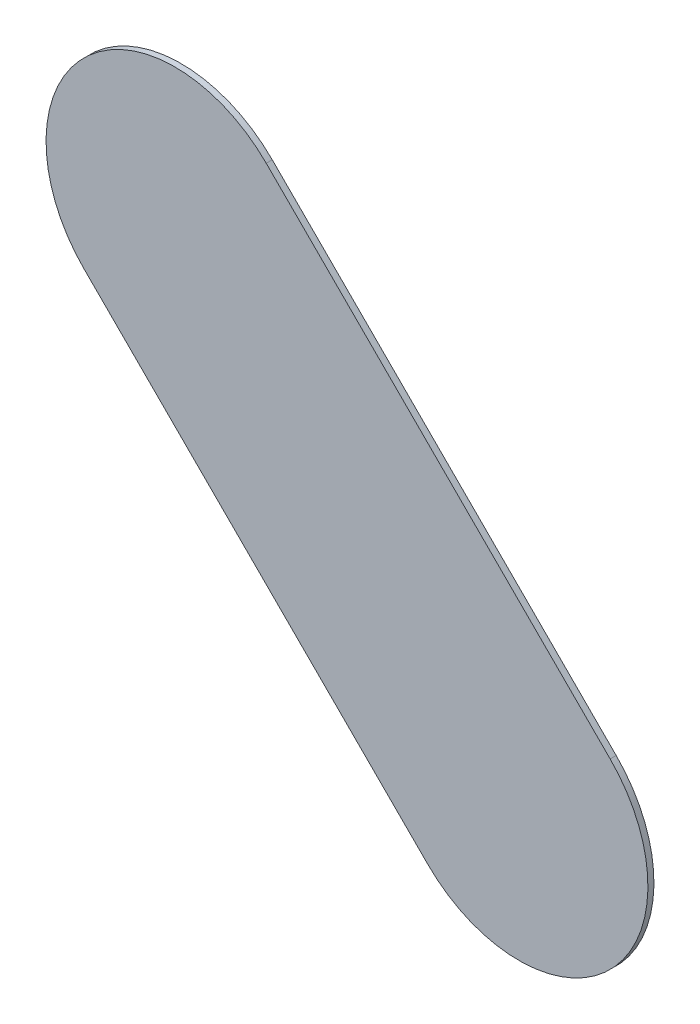
ISO-10303-21;
HEADER;
FILE_DESCRIPTION(('STEP AP214'),'2;1');
FILE_NAME('part.step','',(''),(''),'','','');
FILE_SCHEMA(('AUTOMOTIVE_DESIGN { 1 0 10303 214 1 1 1 1 }'));
ENDSEC;
DATA;
#1=APPLICATION_CONTEXT('core data for automotive mechanical design processes');
#2=APPLICATION_PROTOCOL_DEFINITION('international standard','automotive_design',2000,#1);
#3=PRODUCT_CONTEXT('',#1,'mechanical');
#4=PRODUCT('Part','Part','',(#3));
#5=PRODUCT_RELATED_PRODUCT_CATEGORY('part','',(#4));
#6=PRODUCT_DEFINITION_FORMATION('','',#4);
#7=PRODUCT_DEFINITION_CONTEXT('part definition',#1,'design');
#8=PRODUCT_DEFINITION('design','',#6,#7);
#9=PRODUCT_DEFINITION_SHAPE('','',#8);
#10=(LENGTH_UNIT() NAMED_UNIT(*) SI_UNIT(.MILLI.,.METRE.));
#11=(NAMED_UNIT(*) PLANE_ANGLE_UNIT() SI_UNIT($,.RADIAN.));
#12=(NAMED_UNIT(*) SI_UNIT($,.STERADIAN.) SOLID_ANGLE_UNIT());
#13=UNCERTAINTY_MEASURE_WITH_UNIT(LENGTH_MEASURE(1.E-05),#10,'distance_accuracy_value','');
#14=(GEOMETRIC_REPRESENTATION_CONTEXT(3) GLOBAL_UNCERTAINTY_ASSIGNED_CONTEXT((#13)) GLOBAL_UNIT_ASSIGNED_CONTEXT((#10,
#11,#12)) REPRESENTATION_CONTEXT('',''));
#15=CARTESIAN_POINT('',(0.,0.,0.));
#16=DIRECTION('',(0.,0.,1.));
#17=DIRECTION('',(1.,0.,0.));
#18=AXIS2_PLACEMENT_3D('',#15,#16,#17);
#19=CARTESIAN_POINT('',(26.719669,-7.28033,1.635));
#20=DIRECTION('',(0.,0.,1.));
#21=DIRECTION('',(1.,0.,0.));
#22=AXIS2_PLACEMENT_3D('',#19,#20,#21);
#23=PLANE('',#22);
#24=DIRECTION('',(0.707106781186548,-0.707106781186548,0.));
#25=VECTOR('',#24,1.);
#26=CARTESIAN_POINT('',(26.719669,-7.28033,1.635));
#27=LINE('',#26,#25);
#28=CARTESIAN_POINT('',(26.719669,-7.28033,1.635));
#29=VERTEX_POINT('',#28);
#30=CARTESIAN_POINT('',(28.719669,-9.28033,1.635));
#31=VERTEX_POINT('',#30);
#32=EDGE_CURVE('E72',#29,#31,#27,.T.);
#33=ORIENTED_EDGE('',*,*,#32,.T.);
#34=CARTESIAN_POINT('',(29.2499995,-8.7499995,1.635));
#35=DIRECTION('',(0.,0.,1.));
#36=DIRECTION('',(-0.707106781186548,-0.707106781186548,0.));
#37=AXIS2_PLACEMENT_3D('',#34,#35,#36);
#38=CIRCLE('',#37,0.75000058564);
#39=CARTESIAN_POINT('',(29.78033,-8.219669,1.635));
#40=VERTEX_POINT('',#39);
#41=EDGE_CURVE('E145',#31,#40,#38,.T.);
#42=ORIENTED_EDGE('',*,*,#41,.T.);
#43=DIRECTION('',(-0.707106781186548,0.707106781186548,0.));
#44=VECTOR('',#43,1.);
#45=CARTESIAN_POINT('',(29.78033,-8.219669,1.635));
#46=LINE('',#45,#44);
#47=CARTESIAN_POINT('',(27.78033,-6.219669,1.635));
#48=VERTEX_POINT('',#47);
#49=EDGE_CURVE('E74',#40,#48,#46,.T.);
#50=ORIENTED_EDGE('',*,*,#49,.T.);
#51=CARTESIAN_POINT('',(27.2499995,-6.7499995,1.635));
#52=DIRECTION('',(0.,0.,1.));
#53=DIRECTION('',(0.707106781186548,0.707106781186548,0.));
#54=AXIS2_PLACEMENT_3D('',#51,#52,#53);
#55=CIRCLE('',#54,0.75000058564);
#56=EDGE_CURVE('E11',#48,#29,#55,.T.);
#57=ORIENTED_EDGE('',*,*,#56,.T.);
#58=EDGE_LOOP('',(#33,#42,#50,#57));
#59=FACE_BOUND('',#58,.T.);
#60=ADVANCED_FACE('F16',(#59),#23,.T.);
#61=CARTESIAN_POINT('',(26.719669,-7.28033,1.6));
#62=DIRECTION('',(0.,0.,1.));
#63=DIRECTION('',(1.,0.,0.));
#64=AXIS2_PLACEMENT_3D('',#61,#62,#63);
#65=PLANE('',#64);
#66=CARTESIAN_POINT('',(27.2499995,-6.7499995,1.6));
#67=DIRECTION('',(0.,0.,1.));
#68=DIRECTION('',(0.707106781186548,0.707106781186548,0.));
#69=AXIS2_PLACEMENT_3D('',#66,#67,#68);
#70=CIRCLE('',#69,0.75000058564);
#71=CARTESIAN_POINT('',(27.78033,-6.219669,1.6));
#72=VERTEX_POINT('',#71);
#73=CARTESIAN_POINT('',(26.719669,-7.28033,1.6));
#74=VERTEX_POINT('',#73);
#75=EDGE_CURVE('E27',#72,#74,#70,.T.);
#76=ORIENTED_EDGE('',*,*,#75,.F.);
#77=DIRECTION('',(-0.707106781186548,0.707106781186548,0.));
#78=VECTOR('',#77,1.);
#79=CARTESIAN_POINT('',(29.78033,-8.219669,1.6));
#80=LINE('',#79,#78);
#81=CARTESIAN_POINT('',(29.78033,-8.219669,1.6));
#82=VERTEX_POINT('',#81);
#83=EDGE_CURVE('E64',#82,#72,#80,.T.);
#84=ORIENTED_EDGE('',*,*,#83,.F.);
#85=CARTESIAN_POINT('',(29.2499995,-8.7499995,1.6));
#86=DIRECTION('',(0.,0.,1.));
#87=DIRECTION('',(-0.707106781186548,-0.707106781186548,0.));
#88=AXIS2_PLACEMENT_3D('',#85,#86,#87);
#89=CIRCLE('',#88,0.75000058564);
#90=CARTESIAN_POINT('',(28.719669,-9.28033,1.6));
#91=VERTEX_POINT('',#90);
#92=EDGE_CURVE('E83',#91,#82,#89,.T.);
#93=ORIENTED_EDGE('',*,*,#92,.F.);
#94=DIRECTION('',(0.707106781186548,-0.707106781186548,0.));
#95=VECTOR('',#94,1.);
#96=CARTESIAN_POINT('',(26.719669,-7.28033,1.6));
#97=LINE('',#96,#95);
#98=EDGE_CURVE('E94',#74,#91,#97,.T.);
#99=ORIENTED_EDGE('',*,*,#98,.F.);
#100=EDGE_LOOP('',(#76,#84,#93,#99));
#101=FACE_BOUND('',#100,.T.);
#102=ADVANCED_FACE('F101',(#101),#65,.F.);
#103=CARTESIAN_POINT('',(27.2499995,-6.7499995,1.6));
#104=DIRECTION('',(0.,0.,-1.));
#105=DIRECTION('',(0.707106781186548,0.707106781186548,0.));
#106=AXIS2_PLACEMENT_3D('',#103,#104,#105);
#107=CYLINDRICAL_SURFACE('',#106,0.75000058564);
#108=ORIENTED_EDGE('',*,*,#75,.T.);
#109=DIRECTION('',(0.,0.,1.));
#110=VECTOR('',#109,1.);
#111=CARTESIAN_POINT('',(26.719669,-7.28033,1.6));
#112=LINE('',#111,#110);
#113=EDGE_CURVE('E78',#74,#29,#112,.T.);
#114=ORIENTED_EDGE('',*,*,#113,.T.);
#115=ORIENTED_EDGE('',*,*,#56,.F.);
#116=DIRECTION('',(0.,0.,1.));
#117=VECTOR('',#116,1.);
#118=CARTESIAN_POINT('',(27.78033,-6.219669,1.6));
#119=LINE('',#118,#117);
#120=EDGE_CURVE('E152',#72,#48,#119,.T.);
#121=ORIENTED_EDGE('',*,*,#120,.F.);
#122=EDGE_LOOP('',(#108,#114,#115,#121));
#123=FACE_BOUND('',#122,.T.);
#124=ADVANCED_FACE('F18',(#123),#107,.T.);
#125=CARTESIAN_POINT('',(29.78033,-8.219669,1.6));
#126=DIRECTION('',(-0.707106781186548,-0.707106781186548,0.));
#127=DIRECTION('',(-0.707106781186548,0.707106781186548,0.));
#128=AXIS2_PLACEMENT_3D('',#125,#126,#127);
#129=PLANE('',#128);
#130=ORIENTED_EDGE('',*,*,#83,.T.);
#131=ORIENTED_EDGE('',*,*,#120,.T.);
#132=ORIENTED_EDGE('',*,*,#49,.F.);
#133=DIRECTION('',(0.,0.,1.));
#134=VECTOR('',#133,1.);
#135=CARTESIAN_POINT('',(29.78033,-8.219669,1.6));
#136=LINE('',#135,#134);
#137=EDGE_CURVE('E20',#82,#40,#136,.T.);
#138=ORIENTED_EDGE('',*,*,#137,.F.);
#139=EDGE_LOOP('',(#130,#131,#132,#138));
#140=FACE_BOUND('',#139,.T.);
#141=ADVANCED_FACE('F160',(#140),#129,.F.);
#142=CARTESIAN_POINT('',(29.2499995,-8.7499995,1.6));
#143=DIRECTION('',(0.,0.,-1.));
#144=DIRECTION('',(-0.707106781186548,-0.707106781186548,0.));
#145=AXIS2_PLACEMENT_3D('',#142,#143,#144);
#146=CYLINDRICAL_SURFACE('',#145,0.75000058564);
#147=ORIENTED_EDGE('',*,*,#92,.T.);
#148=ORIENTED_EDGE('',*,*,#137,.T.);
#149=ORIENTED_EDGE('',*,*,#41,.F.);
#150=DIRECTION('',(0.,0.,1.));
#151=VECTOR('',#150,1.);
#152=CARTESIAN_POINT('',(28.719669,-9.28033,1.6));
#153=LINE('',#152,#151);
#154=EDGE_CURVE('E87',#91,#31,#153,.T.);
#155=ORIENTED_EDGE('',*,*,#154,.F.);
#156=EDGE_LOOP('',(#147,#148,#149,#155));
#157=FACE_BOUND('',#156,.T.);
#158=ADVANCED_FACE('F144',(#157),#146,.T.);
#159=CARTESIAN_POINT('',(26.719669,-7.28033,1.6));
#160=DIRECTION('',(0.707106781186548,0.707106781186548,0.));
#161=DIRECTION('',(0.,0.,-1.));
#162=AXIS2_PLACEMENT_3D('',#159,#160,#161);
#163=PLANE('',#162);
#164=ORIENTED_EDGE('',*,*,#98,.T.);
#165=ORIENTED_EDGE('',*,*,#154,.T.);
#166=ORIENTED_EDGE('',*,*,#32,.F.);
#167=ORIENTED_EDGE('',*,*,#113,.F.);
#168=EDGE_LOOP('',(#164,#165,#166,#167));
#169=FACE_BOUND('',#168,.T.);
#170=ADVANCED_FACE('F85',(#169),#163,.F.);
#171=CLOSED_SHELL('',(#60,#102,#124,#141,#158,#170));
#172=MANIFOLD_SOLID_BREP('B1',#171);
#173=ADVANCED_BREP_SHAPE_REPRESENTATION('',(#18,#172),#14);
#174=SHAPE_DEFINITION_REPRESENTATION(#9,#173);
ENDSEC;
END-ISO-10303-21;
